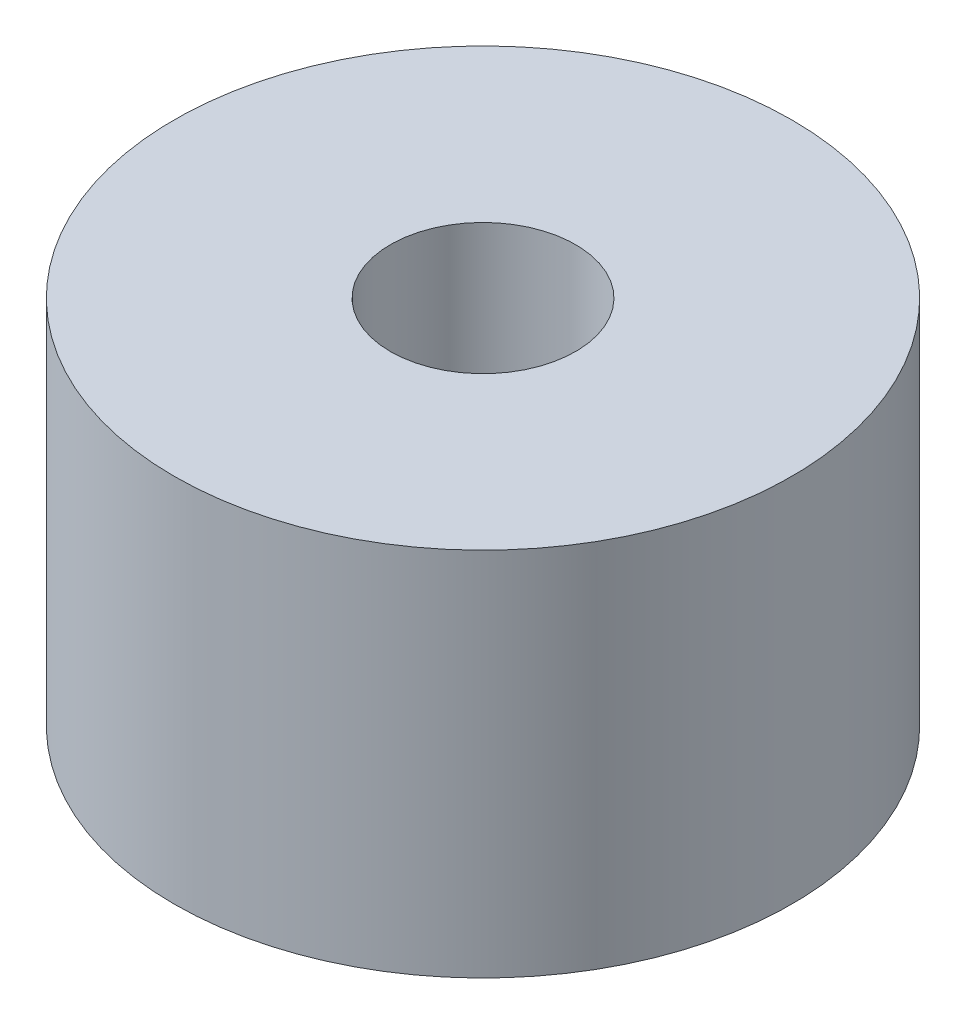
ISO-10303-21;
HEADER;
FILE_DESCRIPTION(('STEP AP214'),'2;1');
FILE_NAME('part.step','',(''),(''),'','','');
FILE_SCHEMA(('AUTOMOTIVE_DESIGN { 1 0 10303 214 1 1 1 1 }'));
ENDSEC;
DATA;
#1=APPLICATION_CONTEXT('core data for automotive mechanical design processes');
#2=APPLICATION_PROTOCOL_DEFINITION('international standard','automotive_design',2000,#1);
#3=PRODUCT_CONTEXT('',#1,'mechanical');
#4=PRODUCT('Part','Part','',(#3));
#5=PRODUCT_RELATED_PRODUCT_CATEGORY('part','',(#4));
#6=PRODUCT_DEFINITION_FORMATION('','',#4);
#7=PRODUCT_DEFINITION_CONTEXT('part definition',#1,'design');
#8=PRODUCT_DEFINITION('design','',#6,#7);
#9=PRODUCT_DEFINITION_SHAPE('','',#8);
#10=(LENGTH_UNIT() NAMED_UNIT(*) SI_UNIT(.MILLI.,.METRE.));
#11=(NAMED_UNIT(*) PLANE_ANGLE_UNIT() SI_UNIT($,.RADIAN.));
#12=(NAMED_UNIT(*) SI_UNIT($,.STERADIAN.) SOLID_ANGLE_UNIT());
#13=UNCERTAINTY_MEASURE_WITH_UNIT(LENGTH_MEASURE(1.E-05),#10,'distance_accuracy_value','');
#14=(GEOMETRIC_REPRESENTATION_CONTEXT(3) GLOBAL_UNCERTAINTY_ASSIGNED_CONTEXT((#13)) GLOBAL_UNIT_ASSIGNED_CONTEXT((#10,
#11,#12)) REPRESENTATION_CONTEXT('',''));
#15=CARTESIAN_POINT('',(0.,0.,0.));
#16=DIRECTION('',(0.,0.,1.));
#17=DIRECTION('',(1.,0.,0.));
#18=AXIS2_PLACEMENT_3D('',#15,#16,#17);
#19=CARTESIAN_POINT('',(0.,3.,0.));
#20=DIRECTION('',(0.,-1.,0.));
#21=DIRECTION('',(0.,0.,-1.));
#22=AXIS2_PLACEMENT_3D('',#19,#20,#21);
#23=CYLINDRICAL_SURFACE('',#22,5.);
#24=CARTESIAN_POINT('',(0.,0.,0.));
#25=DIRECTION('',(0.,1.,0.));
#26=DIRECTION('',(0.,0.,1.));
#27=AXIS2_PLACEMENT_3D('',#24,#25,#26);
#28=CIRCLE('',#27,5.);
#29=CARTESIAN_POINT('',(0.,0.,5.));
#30=VERTEX_POINT('',#29);
#31=EDGE_CURVE('E44',#30,#30,#28,.T.);
#32=ORIENTED_EDGE('',*,*,#31,.T.);
#33=EDGE_LOOP('',(#32));
#34=FACE_BOUND('',#33,.T.);
#35=CARTESIAN_POINT('',(0.,6.,0.));
#36=DIRECTION('',(0.,1.,0.));
#37=DIRECTION('',(0.,0.,1.));
#38=AXIS2_PLACEMENT_3D('',#35,#36,#37);
#39=CIRCLE('',#38,5.);
#40=CARTESIAN_POINT('',(0.,6.,5.));
#41=VERTEX_POINT('',#40);
#42=EDGE_CURVE('E49',#41,#41,#39,.T.);
#43=ORIENTED_EDGE('',*,*,#42,.F.);
#44=EDGE_LOOP('',(#43));
#45=FACE_BOUND('',#44,.T.);
#46=ADVANCED_FACE('F37',(#34,#45),#23,.T.);
#47=CARTESIAN_POINT('',(0.,0.,0.));
#48=DIRECTION('',(0.,1.,0.));
#49=DIRECTION('',(0.,0.,1.));
#50=AXIS2_PLACEMENT_3D('',#47,#48,#49);
#51=PLANE('',#50);
#52=ORIENTED_EDGE('',*,*,#31,.F.);
#53=EDGE_LOOP('',(#52));
#54=FACE_BOUND('',#53,.T.);
#55=ADVANCED_FACE('F65',(#54),#51,.F.);
#56=CARTESIAN_POINT('',(0.,6.,0.));
#57=DIRECTION('',(0.,1.,0.));
#58=DIRECTION('',(0.,0.,1.));
#59=AXIS2_PLACEMENT_3D('',#56,#57,#58);
#60=PLANE('',#59);
#61=ORIENTED_EDGE('',*,*,#42,.T.);
#62=EDGE_LOOP('',(#61));
#63=FACE_BOUND('',#62,.T.);
#64=CARTESIAN_POINT('',(0.,6.,0.));
#65=DIRECTION('',(0.,1.,0.));
#66=DIRECTION('',(0.,0.,1.));
#67=AXIS2_PLACEMENT_3D('',#64,#65,#66);
#68=CIRCLE('',#67,1.5);
#69=CARTESIAN_POINT('',(0.,6.,1.5));
#70=VERTEX_POINT('',#69);
#71=EDGE_CURVE('E54',#70,#70,#68,.T.);
#72=ORIENTED_EDGE('',*,*,#71,.F.);
#73=EDGE_LOOP('',(#72));
#74=FACE_BOUND('',#73,.T.);
#75=ADVANCED_FACE('F63',(#63,#74),#60,.T.);
#76=CARTESIAN_POINT('',(0.,6.,0.));
#77=DIRECTION('',(0.,-1.,0.));
#78=DIRECTION('',(0.,0.,-1.));
#79=AXIS2_PLACEMENT_3D('',#76,#77,#78);
#80=CYLINDRICAL_SURFACE('',#79,1.5);
#81=ORIENTED_EDGE('',*,*,#71,.T.);
#82=EDGE_LOOP('',(#81));
#83=FACE_BOUND('',#82,.T.);
#84=CARTESIAN_POINT('',(0.,3.,0.));
#85=DIRECTION('',(0.,1.,0.));
#86=DIRECTION('',(0.,0.,1.));
#87=AXIS2_PLACEMENT_3D('',#84,#85,#86);
#88=CIRCLE('',#87,1.5);
#89=CARTESIAN_POINT('',(0.,3.,1.5));
#90=VERTEX_POINT('',#89);
#91=EDGE_CURVE('E10',#90,#90,#88,.F.);
#92=ORIENTED_EDGE('',*,*,#91,.T.);
#93=EDGE_LOOP('',(#92));
#94=FACE_BOUND('',#93,.T.);
#95=ADVANCED_FACE('F61',(#83,#94),#80,.F.);
#96=CARTESIAN_POINT('',(0.,3.,0.));
#97=DIRECTION('',(0.,1.,0.));
#98=DIRECTION('',(0.,0.,1.));
#99=AXIS2_PLACEMENT_3D('',#96,#97,#98);
#100=PLANE('',#99);
#101=ORIENTED_EDGE('',*,*,#91,.F.);
#102=EDGE_LOOP('',(#101));
#103=FACE_BOUND('',#102,.T.);
#104=ADVANCED_FACE('F72',(#103),#100,.T.);
#105=CLOSED_SHELL('',(#46,#55,#75,#95,#104));
#106=MANIFOLD_SOLID_BREP('B2',#105);
#107=ADVANCED_BREP_SHAPE_REPRESENTATION('',(#18,#106),#14);
#108=SHAPE_DEFINITION_REPRESENTATION(#9,#107);
ENDSEC;
END-ISO-10303-21;
